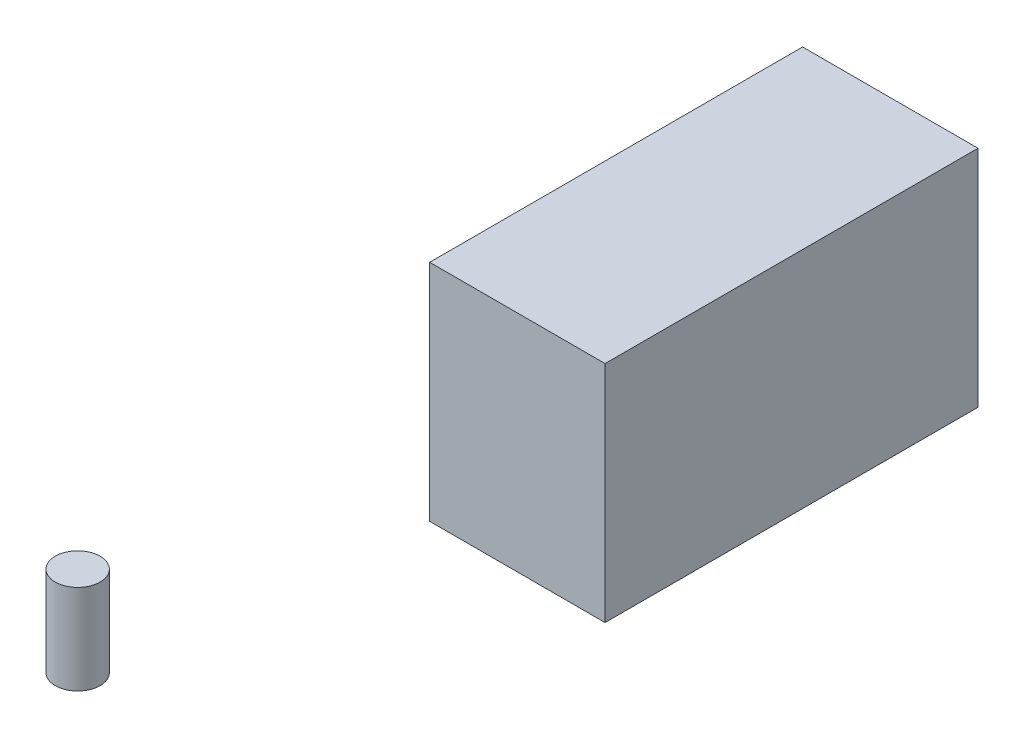
ISO-10303-21;
HEADER;
FILE_DESCRIPTION(('STEP AP214'),'2;1');
FILE_NAME('part.step','',(''),(''),'','','');
FILE_SCHEMA(('AUTOMOTIVE_DESIGN { 1 0 10303 214 1 1 1 1 }'));
ENDSEC;
DATA;
#1=APPLICATION_CONTEXT('core data for automotive mechanical design processes');
#2=APPLICATION_PROTOCOL_DEFINITION('international standard','automotive_design',2000,#1);
#3=PRODUCT_CONTEXT('',#1,'mechanical');
#4=PRODUCT('Part','Part','',(#3));
#5=PRODUCT_RELATED_PRODUCT_CATEGORY('part','',(#4));
#6=PRODUCT_DEFINITION_FORMATION('','',#4);
#7=PRODUCT_DEFINITION_CONTEXT('part definition',#1,'design');
#8=PRODUCT_DEFINITION('design','',#6,#7);
#9=PRODUCT_DEFINITION_SHAPE('','',#8);
#10=(LENGTH_UNIT() NAMED_UNIT(*) SI_UNIT(.MILLI.,.METRE.));
#11=(NAMED_UNIT(*) PLANE_ANGLE_UNIT() SI_UNIT($,.RADIAN.));
#12=(NAMED_UNIT(*) SI_UNIT($,.STERADIAN.) SOLID_ANGLE_UNIT());
#13=UNCERTAINTY_MEASURE_WITH_UNIT(LENGTH_MEASURE(1.E-05),#10,'distance_accuracy_value','');
#14=(GEOMETRIC_REPRESENTATION_CONTEXT(3) GLOBAL_UNCERTAINTY_ASSIGNED_CONTEXT((#13)) GLOBAL_UNIT_ASSIGNED_CONTEXT((#10,
#11,#12)) REPRESENTATION_CONTEXT('',''));
#15=CARTESIAN_POINT('',(0.,0.,0.));
#16=DIRECTION('',(0.,0.,1.));
#17=DIRECTION('',(1.,0.,0.));
#18=AXIS2_PLACEMENT_3D('',#15,#16,#17);
#19=CARTESIAN_POINT('',(24.5471877558321,25.,-75.7821913737392));
#20=DIRECTION('',(-1.,0.,0.));
#21=DIRECTION('',(0.,0.,1.));
#22=AXIS2_PLACEMENT_3D('',#19,#20,#21);
#23=PLANE('',#22);
#24=DIRECTION('',(0.,0.,-1.));
#25=VECTOR('',#24,1.);
#26=CARTESIAN_POINT('',(24.5471877558321,0.,-75.7821913737392));
#27=LINE('',#26,#25);
#28=CARTESIAN_POINT('',(24.5471877558321,0.,-34.2232082455841));
#29=VERTEX_POINT('',#28);
#30=CARTESIAN_POINT('',(24.5471877558321,0.,-75.7821913737392));
#31=VERTEX_POINT('',#30);
#32=EDGE_CURVE('E106',#29,#31,#27,.T.);
#33=ORIENTED_EDGE('',*,*,#32,.T.);
#34=DIRECTION('',(0.,-1.,0.));
#35=VECTOR('',#34,1.);
#36=CARTESIAN_POINT('',(24.5471877558321,25.,-75.7821913737392));
#37=LINE('',#36,#35);
#38=CARTESIAN_POINT('',(24.5471877558321,25.,-75.7821913737392));
#39=VERTEX_POINT('',#38);
#40=EDGE_CURVE('E12',#39,#31,#37,.T.);
#41=ORIENTED_EDGE('',*,*,#40,.F.);
#42=DIRECTION('',(0.,0.,-1.));
#43=VECTOR('',#42,1.);
#44=CARTESIAN_POINT('',(24.5471877558321,25.,-75.7821913737392));
#45=LINE('',#44,#43);
#46=CARTESIAN_POINT('',(24.5471877558321,25.,-34.2232082455841));
#47=VERTEX_POINT('',#46);
#48=EDGE_CURVE('E94',#47,#39,#45,.T.);
#49=ORIENTED_EDGE('',*,*,#48,.F.);
#50=DIRECTION('',(0.,-1.,0.));
#51=VECTOR('',#50,1.);
#52=CARTESIAN_POINT('',(24.5471877558321,25.,-34.2232082455841));
#53=LINE('',#52,#51);
#54=EDGE_CURVE('E102',#47,#29,#53,.T.);
#55=ORIENTED_EDGE('',*,*,#54,.T.);
#56=EDGE_LOOP('',(#33,#41,#49,#55));
#57=FACE_BOUND('',#56,.T.);
#58=ADVANCED_FACE('F43',(#57),#23,.F.);
#59=CARTESIAN_POINT('',(5.,25.,-75.7821913737392));
#60=DIRECTION('',(0.,0.,1.));
#61=DIRECTION('',(1.,0.,0.));
#62=AXIS2_PLACEMENT_3D('',#59,#60,#61);
#63=PLANE('',#62);
#64=DIRECTION('',(-1.,0.,0.));
#65=VECTOR('',#64,1.);
#66=CARTESIAN_POINT('',(5.,0.,-75.7821913737392));
#67=LINE('',#66,#65);
#68=CARTESIAN_POINT('',(5.,0.,-75.7821913737392));
#69=VERTEX_POINT('',#68);
#70=EDGE_CURVE('E98',#31,#69,#67,.T.);
#71=ORIENTED_EDGE('',*,*,#70,.T.);
#72=DIRECTION('',(0.,-1.,0.));
#73=VECTOR('',#72,1.);
#74=CARTESIAN_POINT('',(5.,25.,-75.7821913737392));
#75=LINE('',#74,#73);
#76=CARTESIAN_POINT('',(5.,25.,-75.7821913737392));
#77=VERTEX_POINT('',#76);
#78=EDGE_CURVE('E51',#77,#69,#75,.T.);
#79=ORIENTED_EDGE('',*,*,#78,.F.);
#80=DIRECTION('',(-1.,0.,0.));
#81=VECTOR('',#80,1.);
#82=CARTESIAN_POINT('',(5.,25.,-75.7821913737392));
#83=LINE('',#82,#81);
#84=EDGE_CURVE('E89',#39,#77,#83,.T.);
#85=ORIENTED_EDGE('',*,*,#84,.F.);
#86=ORIENTED_EDGE('',*,*,#40,.T.);
#87=EDGE_LOOP('',(#71,#79,#85,#86));
#88=FACE_BOUND('',#87,.T.);
#89=ADVANCED_FACE('F97',(#88),#63,.F.);
#90=CARTESIAN_POINT('',(5.,25.,-75.7821913737392));
#91=DIRECTION('',(1.,0.,0.));
#92=DIRECTION('',(0.,0.,-1.));
#93=AXIS2_PLACEMENT_3D('',#90,#91,#92);
#94=PLANE('',#93);
#95=DIRECTION('',(0.,0.,1.));
#96=VECTOR('',#95,1.);
#97=CARTESIAN_POINT('',(5.,0.,-75.7821913737392));
#98=LINE('',#97,#96);
#99=CARTESIAN_POINT('',(5.,0.,-34.2232082455841));
#100=VERTEX_POINT('',#99);
#101=EDGE_CURVE('E76',#69,#100,#98,.T.);
#102=ORIENTED_EDGE('',*,*,#101,.T.);
#103=DIRECTION('',(0.,-1.,0.));
#104=VECTOR('',#103,1.);
#105=CARTESIAN_POINT('',(5.,25.,-34.2232082455841));
#106=LINE('',#105,#104);
#107=CARTESIAN_POINT('',(5.,25.,-34.2232082455841));
#108=VERTEX_POINT('',#107);
#109=EDGE_CURVE('E99',#108,#100,#106,.T.);
#110=ORIENTED_EDGE('',*,*,#109,.F.);
#111=DIRECTION('',(0.,0.,1.));
#112=VECTOR('',#111,1.);
#113=CARTESIAN_POINT('',(5.,25.,-75.7821913737392));
#114=LINE('',#113,#112);
#115=EDGE_CURVE('E92',#77,#108,#114,.T.);
#116=ORIENTED_EDGE('',*,*,#115,.F.);
#117=ORIENTED_EDGE('',*,*,#78,.T.);
#118=EDGE_LOOP('',(#102,#110,#116,#117));
#119=FACE_BOUND('',#118,.T.);
#120=ADVANCED_FACE('F100',(#119),#94,.F.);
#121=CARTESIAN_POINT('',(5.,25.,-34.2232082455841));
#122=DIRECTION('',(0.,0.,-1.));
#123=DIRECTION('',(-1.,0.,0.));
#124=AXIS2_PLACEMENT_3D('',#121,#122,#123);
#125=PLANE('',#124);
#126=DIRECTION('',(1.,0.,0.));
#127=VECTOR('',#126,1.);
#128=CARTESIAN_POINT('',(5.,0.,-34.2232082455841));
#129=LINE('',#128,#127);
#130=EDGE_CURVE('E82',#100,#29,#129,.T.);
#131=ORIENTED_EDGE('',*,*,#130,.T.);
#132=ORIENTED_EDGE('',*,*,#54,.F.);
#133=DIRECTION('',(1.,0.,0.));
#134=VECTOR('',#133,1.);
#135=CARTESIAN_POINT('',(5.,25.,-34.2232082455841));
#136=LINE('',#135,#134);
#137=EDGE_CURVE('E59',#108,#47,#136,.T.);
#138=ORIENTED_EDGE('',*,*,#137,.F.);
#139=ORIENTED_EDGE('',*,*,#109,.T.);
#140=EDGE_LOOP('',(#131,#132,#138,#139));
#141=FACE_BOUND('',#140,.T.);
#142=ADVANCED_FACE('F113',(#141),#125,.F.);
#143=CARTESIAN_POINT('',(0.,25.,0.));
#144=DIRECTION('',(0.,1.,0.));
#145=DIRECTION('',(0.,0.,1.));
#146=AXIS2_PLACEMENT_3D('',#143,#144,#145);
#147=PLANE('',#146);
#148=ORIENTED_EDGE('',*,*,#48,.T.);
#149=ORIENTED_EDGE('',*,*,#84,.T.);
#150=ORIENTED_EDGE('',*,*,#115,.T.);
#151=ORIENTED_EDGE('',*,*,#137,.T.);
#152=EDGE_LOOP('',(#148,#149,#150,#151));
#153=FACE_BOUND('',#152,.T.);
#154=ADVANCED_FACE('F90',(#153),#147,.T.);
#155=CARTESIAN_POINT('',(0.,0.,0.));
#156=DIRECTION('',(0.,1.,0.));
#157=DIRECTION('',(0.,0.,1.));
#158=AXIS2_PLACEMENT_3D('',#155,#156,#157);
#159=PLANE('',#158);
#160=ORIENTED_EDGE('',*,*,#32,.F.);
#161=ORIENTED_EDGE('',*,*,#130,.F.);
#162=ORIENTED_EDGE('',*,*,#101,.F.);
#163=ORIENTED_EDGE('',*,*,#70,.F.);
#164=EDGE_LOOP('',(#160,#161,#162,#163));
#165=FACE_BOUND('',#164,.T.);
#166=ADVANCED_FACE('F116',(#165),#159,.F.);
#167=CLOSED_SHELL('',(#58,#89,#120,#142,#154,#166));
#168=MANIFOLD_SOLID_BREP('B2_NOT_SHOWN',#167);
#169=CARTESIAN_POINT('',(0.,10.,0.));
#170=DIRECTION('',(0.,-1.,0.));
#171=DIRECTION('',(0.,0.,-1.));
#172=AXIS2_PLACEMENT_3D('',#169,#170,#171);
#173=CYLINDRICAL_SURFACE('',#172,2.5);
#174=CARTESIAN_POINT('',(0.,10.,0.));
#175=DIRECTION('',(0.,1.,0.));
#176=DIRECTION('',(0.,0.,1.));
#177=AXIS2_PLACEMENT_3D('',#174,#175,#176);
#178=CIRCLE('',#177,2.5);
#179=CARTESIAN_POINT('',(0.,10.,2.5));
#180=VERTEX_POINT('',#179);
#181=EDGE_CURVE('E42',#180,#180,#178,.T.);
#182=ORIENTED_EDGE('',*,*,#181,.F.);
#183=EDGE_LOOP('',(#182));
#184=FACE_BOUND('',#183,.T.);
#185=CARTESIAN_POINT('',(0.,0.,0.));
#186=DIRECTION('',(0.,1.,0.));
#187=DIRECTION('',(0.,0.,1.));
#188=AXIS2_PLACEMENT_3D('',#185,#186,#187);
#189=CIRCLE('',#188,2.5);
#190=CARTESIAN_POINT('',(0.,0.,2.5));
#191=VERTEX_POINT('',#190);
#192=EDGE_CURVE('E169',#191,#191,#189,.T.);
#193=ORIENTED_EDGE('',*,*,#192,.T.);
#194=EDGE_LOOP('',(#193));
#195=FACE_BOUND('',#194,.T.);
#196=ADVANCED_FACE('F166',(#184,#195),#173,.T.);
#197=CARTESIAN_POINT('',(0.,10.,0.));
#198=DIRECTION('',(0.,1.,0.));
#199=DIRECTION('',(0.,0.,1.));
#200=AXIS2_PLACEMENT_3D('',#197,#198,#199);
#201=PLANE('',#200);
#202=ORIENTED_EDGE('',*,*,#181,.T.);
#203=EDGE_LOOP('',(#202));
#204=FACE_BOUND('',#203,.T.);
#205=ADVANCED_FACE('F181',(#204),#201,.T.);
#206=CARTESIAN_POINT('',(0.,0.,0.));
#207=DIRECTION('',(0.,1.,0.));
#208=DIRECTION('',(0.,0.,1.));
#209=AXIS2_PLACEMENT_3D('',#206,#207,#208);
#210=PLANE('',#209);
#211=ORIENTED_EDGE('',*,*,#192,.F.);
#212=EDGE_LOOP('',(#211));
#213=FACE_BOUND('',#212,.T.);
#214=ADVANCED_FACE('F179',(#213),#210,.F.);
#215=CLOSED_SHELL('',(#196,#205,#214));
#216=MANIFOLD_SOLID_BREP('B6',#215);
#217=ADVANCED_BREP_SHAPE_REPRESENTATION('',(#18,#168,#216),#14);
#218=SHAPE_DEFINITION_REPRESENTATION(#9,#217);
ENDSEC;
END-ISO-10303-21;
